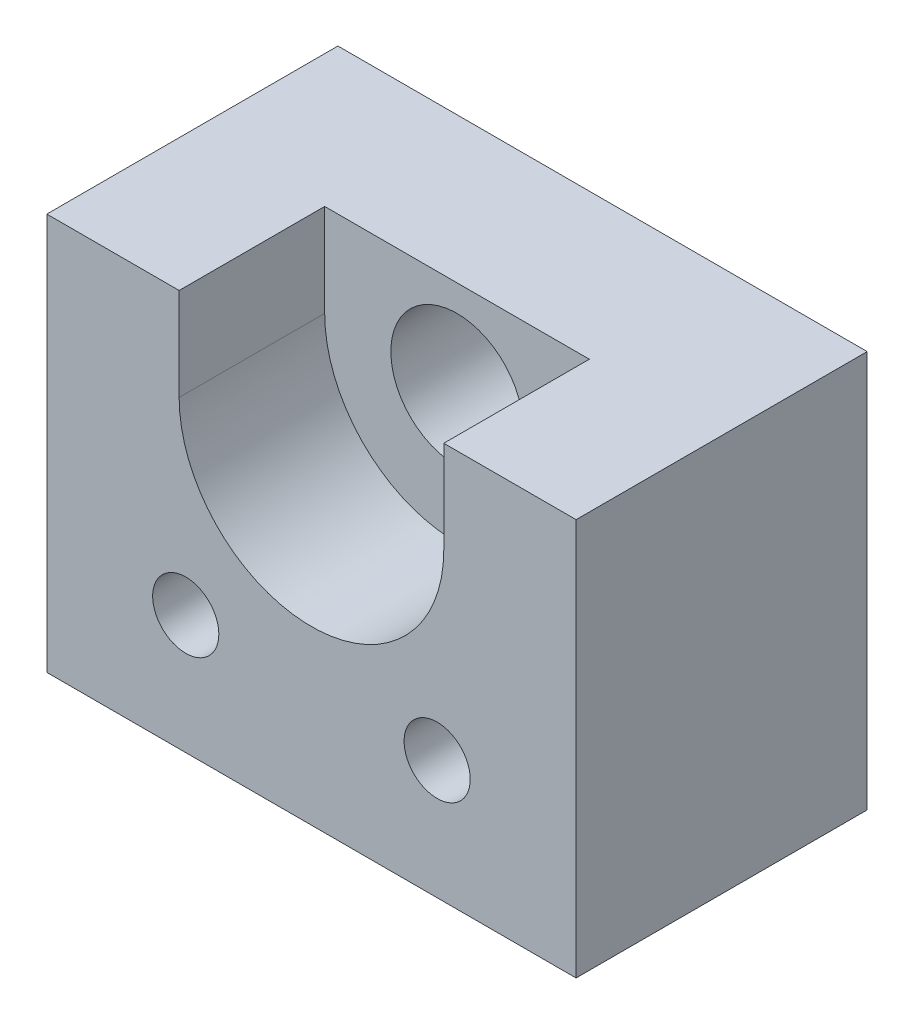
ISO-10303-21;
HEADER;
FILE_DESCRIPTION(('STEP AP214'),'2;1');
FILE_NAME('part.step','',(''),(''),'','','');
FILE_SCHEMA(('AUTOMOTIVE_DESIGN { 1 0 10303 214 1 1 1 1 }'));
ENDSEC;
DATA;
#1=APPLICATION_CONTEXT('core data for automotive mechanical design processes');
#2=APPLICATION_PROTOCOL_DEFINITION('international standard','automotive_design',2000,#1);
#3=PRODUCT_CONTEXT('',#1,'mechanical');
#4=PRODUCT('Part','Part','',(#3));
#5=PRODUCT_RELATED_PRODUCT_CATEGORY('part','',(#4));
#6=PRODUCT_DEFINITION_FORMATION('','',#4);
#7=PRODUCT_DEFINITION_CONTEXT('part definition',#1,'design');
#8=PRODUCT_DEFINITION('design','',#6,#7);
#9=PRODUCT_DEFINITION_SHAPE('','',#8);
#10=(LENGTH_UNIT() NAMED_UNIT(*) SI_UNIT(.MILLI.,.METRE.));
#11=(NAMED_UNIT(*) PLANE_ANGLE_UNIT() SI_UNIT($,.RADIAN.));
#12=(NAMED_UNIT(*) SI_UNIT($,.STERADIAN.) SOLID_ANGLE_UNIT());
#13=UNCERTAINTY_MEASURE_WITH_UNIT(LENGTH_MEASURE(1.E-05),#10,'distance_accuracy_value','');
#14=(GEOMETRIC_REPRESENTATION_CONTEXT(3) GLOBAL_UNCERTAINTY_ASSIGNED_CONTEXT((#13)) GLOBAL_UNIT_ASSIGNED_CONTEXT((#10,
#11,#12)) REPRESENTATION_CONTEXT('',''));
#15=CARTESIAN_POINT('',(0.,0.,0.));
#16=DIRECTION('',(0.,0.,1.));
#17=DIRECTION('',(1.,0.,0.));
#18=AXIS2_PLACEMENT_3D('',#15,#16,#17);
#19=CARTESIAN_POINT('',(10.,11.5,11.));
#20=DIRECTION('',(0.,0.,-1.));
#21=DIRECTION('',(-1.,0.,0.));
#22=AXIS2_PLACEMENT_3D('',#19,#20,#21);
#23=CYLINDRICAL_SURFACE('',#22,2.5);
#24=CARTESIAN_POINT('',(10.,11.5,0.));
#25=DIRECTION('',(0.,0.,1.));
#26=DIRECTION('',(1.,0.,0.));
#27=AXIS2_PLACEMENT_3D('',#24,#25,#26);
#28=CIRCLE('',#27,2.5);
#29=CARTESIAN_POINT('',(12.5,11.5,0.));
#30=VERTEX_POINT('',#29);
#31=EDGE_CURVE('E196',#30,#30,#28,.T.);
#32=ORIENTED_EDGE('',*,*,#31,.F.);
#33=EDGE_LOOP('',(#32));
#34=FACE_BOUND('',#33,.T.);
#35=CARTESIAN_POINT('',(10.,11.5,5.5));
#36=DIRECTION('',(0.,0.,1.));
#37=DIRECTION('',(1.,0.,0.));
#38=AXIS2_PLACEMENT_3D('',#35,#36,#37);
#39=CIRCLE('',#38,2.5);
#40=CARTESIAN_POINT('',(12.5,11.5,5.5));
#41=VERTEX_POINT('',#40);
#42=EDGE_CURVE('E179',#41,#41,#39,.T.);
#43=ORIENTED_EDGE('',*,*,#42,.T.);
#44=EDGE_LOOP('',(#43));
#45=FACE_BOUND('',#44,.T.);
#46=ADVANCED_FACE('F33',(#34,#45),#23,.F.);
#47=CARTESIAN_POINT('',(0.,0.,11.));
#48=DIRECTION('',(0.,0.,-1.));
#49=DIRECTION('',(-1.,0.,0.));
#50=AXIS2_PLACEMENT_3D('',#47,#48,#49);
#51=PLANE('',#50);
#52=CARTESIAN_POINT('',(5.25,4.5,11.));
#53=DIRECTION('',(0.,0.,1.));
#54=DIRECTION('',(1.,0.,0.));
#55=AXIS2_PLACEMENT_3D('',#52,#53,#54);
#56=CIRCLE('',#55,1.25);
#57=CARTESIAN_POINT('',(6.5,4.5,11.));
#58=VERTEX_POINT('',#57);
#59=EDGE_CURVE('E193',#58,#58,#56,.T.);
#60=ORIENTED_EDGE('',*,*,#59,.F.);
#61=EDGE_LOOP('',(#60));
#62=FACE_BOUND('',#61,.T.);
#63=CARTESIAN_POINT('',(10.,11.5,11.));
#64=DIRECTION('',(0.,0.,1.));
#65=DIRECTION('',(1.,0.,0.));
#66=AXIS2_PLACEMENT_3D('',#63,#64,#65);
#67=CIRCLE('',#66,5.);
#68=CARTESIAN_POINT('',(5.,11.5,11.));
#69=VERTEX_POINT('',#68);
#70=CARTESIAN_POINT('',(15.,11.5,11.));
#71=VERTEX_POINT('',#70);
#72=EDGE_CURVE('E144',#69,#71,#67,.T.);
#73=ORIENTED_EDGE('',*,*,#72,.F.);
#74=DIRECTION('',(0.,-1.,0.));
#75=VECTOR('',#74,1.);
#76=CARTESIAN_POINT('',(5.,15.,11.));
#77=LINE('',#76,#75);
#78=CARTESIAN_POINT('',(5.,15.,11.));
#79=VERTEX_POINT('',#78);
#80=EDGE_CURVE('E166',#79,#69,#77,.T.);
#81=ORIENTED_EDGE('',*,*,#80,.F.);
#82=DIRECTION('',(-1.,0.,0.));
#83=VECTOR('',#82,1.);
#84=CARTESIAN_POINT('',(0.,15.,11.));
#85=LINE('',#84,#83);
#86=CARTESIAN_POINT('',(0.,15.,11.));
#87=VERTEX_POINT('',#86);
#88=EDGE_CURVE('E210',#79,#87,#85,.T.);
#89=ORIENTED_EDGE('',*,*,#88,.T.);
#90=DIRECTION('',(0.,-1.,0.));
#91=VECTOR('',#90,1.);
#92=CARTESIAN_POINT('',(0.,0.,11.));
#93=LINE('',#92,#91);
#94=CARTESIAN_POINT('',(0.,0.,11.));
#95=VERTEX_POINT('',#94);
#96=EDGE_CURVE('E202',#87,#95,#93,.T.);
#97=ORIENTED_EDGE('',*,*,#96,.T.);
#98=DIRECTION('',(1.,0.,0.));
#99=VECTOR('',#98,1.);
#100=CARTESIAN_POINT('',(0.,0.,11.));
#101=LINE('',#100,#99);
#102=CARTESIAN_POINT('',(20.,0.,11.));
#103=VERTEX_POINT('',#102);
#104=EDGE_CURVE('E205',#95,#103,#101,.T.);
#105=ORIENTED_EDGE('',*,*,#104,.T.);
#106=DIRECTION('',(0.,1.,0.));
#107=VECTOR('',#106,1.);
#108=CARTESIAN_POINT('',(20.,0.,11.));
#109=LINE('',#108,#107);
#110=CARTESIAN_POINT('',(20.,15.,11.));
#111=VERTEX_POINT('',#110);
#112=EDGE_CURVE('E208',#103,#111,#109,.T.);
#113=ORIENTED_EDGE('',*,*,#112,.T.);
#114=CARTESIAN_POINT('',(15.,15.,11.));
#115=VERTEX_POINT('',#114);
#116=EDGE_CURVE('E211',#111,#115,#85,.T.);
#117=ORIENTED_EDGE('',*,*,#116,.T.);
#118=DIRECTION('',(0.,1.,0.));
#119=VECTOR('',#118,1.);
#120=CARTESIAN_POINT('',(15.,11.5,11.));
#121=LINE('',#120,#119);
#122=EDGE_CURVE('E147',#71,#115,#121,.T.);
#123=ORIENTED_EDGE('',*,*,#122,.F.);
#124=EDGE_LOOP('',(#73,#81,#89,#97,#105,#113,#117,#123));
#125=FACE_BOUND('',#124,.T.);
#126=CARTESIAN_POINT('',(14.75,4.5,11.));
#127=DIRECTION('',(0.,0.,1.));
#128=DIRECTION('',(1.,0.,0.));
#129=AXIS2_PLACEMENT_3D('',#126,#127,#128);
#130=CIRCLE('',#129,1.25);
#131=CARTESIAN_POINT('',(16.,4.5,11.));
#132=VERTEX_POINT('',#131);
#133=EDGE_CURVE('E186',#132,#132,#130,.T.);
#134=ORIENTED_EDGE('',*,*,#133,.F.);
#135=EDGE_LOOP('',(#134));
#136=FACE_BOUND('',#135,.T.);
#137=ADVANCED_FACE('F265',(#62,#125,#136),#51,.F.);
#138=CARTESIAN_POINT('',(0.,0.,0.));
#139=DIRECTION('',(0.,0.,-1.));
#140=DIRECTION('',(-1.,0.,0.));
#141=AXIS2_PLACEMENT_3D('',#138,#139,#140);
#142=PLANE('',#141);
#143=DIRECTION('',(0.,-1.,0.));
#144=VECTOR('',#143,1.);
#145=CARTESIAN_POINT('',(12.4,0.,0.));
#146=LINE('',#145,#144);
#147=CARTESIAN_POINT('',(12.4,6.,0.));
#148=VERTEX_POINT('',#147);
#149=CARTESIAN_POINT('',(12.4,0.,0.));
#150=VERTEX_POINT('',#149);
#151=EDGE_CURVE('E143',#148,#150,#146,.T.);
#152=ORIENTED_EDGE('',*,*,#151,.F.);
#153=DIRECTION('',(1.,0.,0.));
#154=VECTOR('',#153,1.);
#155=CARTESIAN_POINT('',(12.4,6.,0.));
#156=LINE('',#155,#154);
#157=CARTESIAN_POINT('',(7.6,6.,0.));
#158=VERTEX_POINT('',#157);
#159=EDGE_CURVE('E129',#158,#148,#156,.T.);
#160=ORIENTED_EDGE('',*,*,#159,.F.);
#161=DIRECTION('',(0.,1.,0.));
#162=VECTOR('',#161,1.);
#163=CARTESIAN_POINT('',(7.6,0.,0.));
#164=LINE('',#163,#162);
#165=CARTESIAN_POINT('',(7.6,0.,0.));
#166=VERTEX_POINT('',#165);
#167=EDGE_CURVE('E157',#166,#158,#164,.T.);
#168=ORIENTED_EDGE('',*,*,#167,.F.);
#169=DIRECTION('',(1.,0.,0.));
#170=VECTOR('',#169,1.);
#171=CARTESIAN_POINT('',(0.,0.,0.));
#172=LINE('',#171,#170);
#173=CARTESIAN_POINT('',(0.,0.,0.));
#174=VERTEX_POINT('',#173);
#175=EDGE_CURVE('E226',#174,#166,#172,.T.);
#176=ORIENTED_EDGE('',*,*,#175,.F.);
#177=DIRECTION('',(0.,-1.,0.));
#178=VECTOR('',#177,1.);
#179=CARTESIAN_POINT('',(0.,0.,0.));
#180=LINE('',#179,#178);
#181=CARTESIAN_POINT('',(0.,15.,0.));
#182=VERTEX_POINT('',#181);
#183=EDGE_CURVE('E201',#182,#174,#180,.T.);
#184=ORIENTED_EDGE('',*,*,#183,.F.);
#185=DIRECTION('',(-1.,0.,0.));
#186=VECTOR('',#185,1.);
#187=CARTESIAN_POINT('',(0.,15.,0.));
#188=LINE('',#187,#186);
#189=CARTESIAN_POINT('',(20.,15.,0.));
#190=VERTEX_POINT('',#189);
#191=EDGE_CURVE('E206',#190,#182,#188,.T.);
#192=ORIENTED_EDGE('',*,*,#191,.F.);
#193=DIRECTION('',(0.,1.,0.));
#194=VECTOR('',#193,1.);
#195=CARTESIAN_POINT('',(20.,0.,0.));
#196=LINE('',#195,#194);
#197=CARTESIAN_POINT('',(20.,0.,0.));
#198=VERTEX_POINT('',#197);
#199=EDGE_CURVE('E220',#198,#190,#196,.T.);
#200=ORIENTED_EDGE('',*,*,#199,.F.);
#201=EDGE_CURVE('E217',#150,#198,#172,.T.);
#202=ORIENTED_EDGE('',*,*,#201,.F.);
#203=EDGE_LOOP('',(#152,#160,#168,#176,#184,#192,#200,#202));
#204=FACE_BOUND('',#203,.T.);
#205=CARTESIAN_POINT('',(5.25,4.5,0.));
#206=DIRECTION('',(0.,0.,1.));
#207=DIRECTION('',(1.,0.,0.));
#208=AXIS2_PLACEMENT_3D('',#205,#206,#207);
#209=CIRCLE('',#208,1.25);
#210=CARTESIAN_POINT('',(6.5,4.5,0.));
#211=VERTEX_POINT('',#210);
#212=EDGE_CURVE('E189',#211,#211,#209,.T.);
#213=ORIENTED_EDGE('',*,*,#212,.T.);
#214=EDGE_LOOP('',(#213));
#215=FACE_BOUND('',#214,.T.);
#216=ORIENTED_EDGE('',*,*,#31,.T.);
#217=EDGE_LOOP('',(#216));
#218=FACE_BOUND('',#217,.T.);
#219=CARTESIAN_POINT('',(14.75,4.5,0.));
#220=DIRECTION('',(0.,0.,1.));
#221=DIRECTION('',(1.,0.,0.));
#222=AXIS2_PLACEMENT_3D('',#219,#220,#221);
#223=CIRCLE('',#222,1.25);
#224=CARTESIAN_POINT('',(16.,4.5,0.));
#225=VERTEX_POINT('',#224);
#226=EDGE_CURVE('E190',#225,#225,#223,.T.);
#227=ORIENTED_EDGE('',*,*,#226,.T.);
#228=EDGE_LOOP('',(#227));
#229=FACE_BOUND('',#228,.T.);
#230=ADVANCED_FACE('F254',(#204,#215,#218,#229),#142,.T.);
#231=CARTESIAN_POINT('',(0.,0.,11.));
#232=DIRECTION('',(1.,0.,0.));
#233=DIRECTION('',(0.,0.,-1.));
#234=AXIS2_PLACEMENT_3D('',#231,#232,#233);
#235=PLANE('',#234);
#236=ORIENTED_EDGE('',*,*,#183,.T.);
#237=DIRECTION('',(0.,0.,-1.));
#238=VECTOR('',#237,1.);
#239=CARTESIAN_POINT('',(0.,0.,11.));
#240=LINE('',#239,#238);
#241=EDGE_CURVE('E230',#95,#174,#240,.T.);
#242=ORIENTED_EDGE('',*,*,#241,.F.);
#243=ORIENTED_EDGE('',*,*,#96,.F.);
#244=DIRECTION('',(0.,0.,-1.));
#245=VECTOR('',#244,1.);
#246=CARTESIAN_POINT('',(0.,15.,11.));
#247=LINE('',#246,#245);
#248=EDGE_CURVE('E214',#87,#182,#247,.T.);
#249=ORIENTED_EDGE('',*,*,#248,.T.);
#250=EDGE_LOOP('',(#236,#242,#243,#249));
#251=FACE_BOUND('',#250,.T.);
#252=ADVANCED_FACE('F258',(#251),#235,.F.);
#253=CARTESIAN_POINT('',(0.,0.,11.));
#254=DIRECTION('',(0.,1.,0.));
#255=DIRECTION('',(0.,0.,1.));
#256=AXIS2_PLACEMENT_3D('',#253,#254,#255);
#257=PLANE('',#256);
#258=ORIENTED_EDGE('',*,*,#175,.T.);
#259=DIRECTION('',(0.,0.,1.));
#260=VECTOR('',#259,1.);
#261=CARTESIAN_POINT('',(7.6,0.,-5.));
#262=LINE('',#261,#260);
#263=CARTESIAN_POINT('',(7.6,0.,-5.));
#264=VERTEX_POINT('',#263);
#265=EDGE_CURVE('E138',#264,#166,#262,.T.);
#266=ORIENTED_EDGE('',*,*,#265,.F.);
#267=DIRECTION('',(-1.,0.,0.));
#268=VECTOR('',#267,1.);
#269=CARTESIAN_POINT('',(12.4,0.,-5.));
#270=LINE('',#269,#268);
#271=CARTESIAN_POINT('',(12.4,0.,-5.));
#272=VERTEX_POINT('',#271);
#273=EDGE_CURVE('E124',#272,#264,#270,.T.);
#274=ORIENTED_EDGE('',*,*,#273,.F.);
#275=DIRECTION('',(0.,0.,1.));
#276=VECTOR('',#275,1.);
#277=CARTESIAN_POINT('',(12.4,0.,-5.));
#278=LINE('',#277,#276);
#279=EDGE_CURVE('E135',#272,#150,#278,.T.);
#280=ORIENTED_EDGE('',*,*,#279,.T.);
#281=ORIENTED_EDGE('',*,*,#201,.T.);
#282=DIRECTION('',(0.,0.,-1.));
#283=VECTOR('',#282,1.);
#284=CARTESIAN_POINT('',(20.,0.,11.));
#285=LINE('',#284,#283);
#286=EDGE_CURVE('E233',#103,#198,#285,.T.);
#287=ORIENTED_EDGE('',*,*,#286,.F.);
#288=ORIENTED_EDGE('',*,*,#104,.F.);
#289=ORIENTED_EDGE('',*,*,#241,.T.);
#290=EDGE_LOOP('',(#258,#266,#274,#280,#281,#287,#288,#289));
#291=FACE_BOUND('',#290,.T.);
#292=ADVANCED_FACE('F134',(#291),#257,.F.);
#293=CARTESIAN_POINT('',(20.,0.,11.));
#294=DIRECTION('',(-1.,0.,0.));
#295=DIRECTION('',(0.,0.,1.));
#296=AXIS2_PLACEMENT_3D('',#293,#294,#295);
#297=PLANE('',#296);
#298=ORIENTED_EDGE('',*,*,#199,.T.);
#299=DIRECTION('',(0.,0.,-1.));
#300=VECTOR('',#299,1.);
#301=CARTESIAN_POINT('',(20.,15.,11.));
#302=LINE('',#301,#300);
#303=EDGE_CURVE('E236',#111,#190,#302,.T.);
#304=ORIENTED_EDGE('',*,*,#303,.F.);
#305=ORIENTED_EDGE('',*,*,#112,.F.);
#306=ORIENTED_EDGE('',*,*,#286,.T.);
#307=EDGE_LOOP('',(#298,#304,#305,#306));
#308=FACE_BOUND('',#307,.T.);
#309=ADVANCED_FACE('F246',(#308),#297,.F.);
#310=CARTESIAN_POINT('',(0.,15.,11.));
#311=DIRECTION('',(0.,-1.,0.));
#312=DIRECTION('',(0.,0.,-1.));
#313=AXIS2_PLACEMENT_3D('',#310,#311,#312);
#314=PLANE('',#313);
#315=ORIENTED_EDGE('',*,*,#88,.F.);
#316=DIRECTION('',(0.,0.,1.));
#317=VECTOR('',#316,1.);
#318=CARTESIAN_POINT('',(5.,15.,5.5));
#319=LINE('',#318,#317);
#320=CARTESIAN_POINT('',(5.,15.,5.5));
#321=VERTEX_POINT('',#320);
#322=EDGE_CURVE('E180',#321,#79,#319,.T.);
#323=ORIENTED_EDGE('',*,*,#322,.F.);
#324=DIRECTION('',(-1.,0.,0.));
#325=VECTOR('',#324,1.);
#326=CARTESIAN_POINT('',(15.,15.,5.5));
#327=LINE('',#326,#325);
#328=CARTESIAN_POINT('',(15.,15.,5.5));
#329=VERTEX_POINT('',#328);
#330=EDGE_CURVE('E168',#329,#321,#327,.T.);
#331=ORIENTED_EDGE('',*,*,#330,.F.);
#332=DIRECTION('',(0.,0.,1.));
#333=VECTOR('',#332,1.);
#334=CARTESIAN_POINT('',(15.,15.,5.5));
#335=LINE('',#334,#333);
#336=EDGE_CURVE('E182',#329,#115,#335,.T.);
#337=ORIENTED_EDGE('',*,*,#336,.T.);
#338=ORIENTED_EDGE('',*,*,#116,.F.);
#339=ORIENTED_EDGE('',*,*,#303,.T.);
#340=ORIENTED_EDGE('',*,*,#191,.T.);
#341=ORIENTED_EDGE('',*,*,#248,.F.);
#342=EDGE_LOOP('',(#315,#323,#331,#337,#338,#339,#340,#341));
#343=FACE_BOUND('',#342,.T.);
#344=ADVANCED_FACE('F252',(#343),#314,.F.);
#345=CARTESIAN_POINT('',(5.25,4.5,11.));
#346=DIRECTION('',(0.,0.,-1.));
#347=DIRECTION('',(-1.,0.,0.));
#348=AXIS2_PLACEMENT_3D('',#345,#346,#347);
#349=CYLINDRICAL_SURFACE('',#348,1.25);
#350=ORIENTED_EDGE('',*,*,#59,.T.);
#351=EDGE_LOOP('',(#350));
#352=FACE_BOUND('',#351,.T.);
#353=ORIENTED_EDGE('',*,*,#212,.F.);
#354=EDGE_LOOP('',(#353));
#355=FACE_BOUND('',#354,.T.);
#356=ADVANCED_FACE('F294',(#352,#355),#349,.F.);
#357=CARTESIAN_POINT('',(14.75,4.5,11.));
#358=DIRECTION('',(0.,0.,-1.));
#359=DIRECTION('',(-1.,0.,0.));
#360=AXIS2_PLACEMENT_3D('',#357,#358,#359);
#361=CYLINDRICAL_SURFACE('',#360,1.25);
#362=ORIENTED_EDGE('',*,*,#133,.T.);
#363=EDGE_LOOP('',(#362));
#364=FACE_BOUND('',#363,.T.);
#365=ORIENTED_EDGE('',*,*,#226,.F.);
#366=EDGE_LOOP('',(#365));
#367=FACE_BOUND('',#366,.T.);
#368=ADVANCED_FACE('F330',(#364,#367),#361,.F.);
#369=CARTESIAN_POINT('',(10.,11.5,5.5));
#370=DIRECTION('',(0.,0.,1.));
#371=DIRECTION('',(1.,0.,0.));
#372=AXIS2_PLACEMENT_3D('',#369,#370,#371);
#373=CYLINDRICAL_SURFACE('',#372,5.);
#374=ORIENTED_EDGE('',*,*,#72,.T.);
#375=DIRECTION('',(0.,0.,1.));
#376=VECTOR('',#375,1.);
#377=CARTESIAN_POINT('',(15.,11.5,5.5));
#378=LINE('',#377,#376);
#379=CARTESIAN_POINT('',(15.,11.5,5.5));
#380=VERTEX_POINT('',#379);
#381=EDGE_CURVE('E172',#380,#71,#378,.T.);
#382=ORIENTED_EDGE('',*,*,#381,.F.);
#383=CARTESIAN_POINT('',(10.,11.5,5.5));
#384=DIRECTION('',(0.,0.,1.));
#385=DIRECTION('',(1.,0.,0.));
#386=AXIS2_PLACEMENT_3D('',#383,#384,#385);
#387=CIRCLE('',#386,5.);
#388=CARTESIAN_POINT('',(5.,11.5,5.5));
#389=VERTEX_POINT('',#388);
#390=EDGE_CURVE('E162',#389,#380,#387,.T.);
#391=ORIENTED_EDGE('',*,*,#390,.F.);
#392=DIRECTION('',(0.,0.,1.));
#393=VECTOR('',#392,1.);
#394=CARTESIAN_POINT('',(5.,11.5,5.5));
#395=LINE('',#394,#393);
#396=EDGE_CURVE('E177',#389,#69,#395,.T.);
#397=ORIENTED_EDGE('',*,*,#396,.T.);
#398=EDGE_LOOP('',(#374,#382,#391,#397));
#399=FACE_BOUND('',#398,.T.);
#400=ADVANCED_FACE('F337',(#399),#373,.F.);
#401=CARTESIAN_POINT('',(5.,15.,5.5));
#402=DIRECTION('',(-1.,0.,0.));
#403=DIRECTION('',(0.,0.,1.));
#404=AXIS2_PLACEMENT_3D('',#401,#402,#403);
#405=PLANE('',#404);
#406=ORIENTED_EDGE('',*,*,#80,.T.);
#407=ORIENTED_EDGE('',*,*,#396,.F.);
#408=DIRECTION('',(0.,-1.,0.));
#409=VECTOR('',#408,1.);
#410=CARTESIAN_POINT('',(5.,15.,5.5));
#411=LINE('',#410,#409);
#412=EDGE_CURVE('E170',#321,#389,#411,.T.);
#413=ORIENTED_EDGE('',*,*,#412,.F.);
#414=ORIENTED_EDGE('',*,*,#322,.T.);
#415=EDGE_LOOP('',(#406,#407,#413,#414));
#416=FACE_BOUND('',#415,.T.);
#417=ADVANCED_FACE('F269',(#416),#405,.F.);
#418=CARTESIAN_POINT('',(15.,11.5,5.5));
#419=DIRECTION('',(1.,0.,0.));
#420=DIRECTION('',(0.,0.,-1.));
#421=AXIS2_PLACEMENT_3D('',#418,#419,#420);
#422=PLANE('',#421);
#423=ORIENTED_EDGE('',*,*,#122,.T.);
#424=ORIENTED_EDGE('',*,*,#336,.F.);
#425=DIRECTION('',(0.,1.,0.));
#426=VECTOR('',#425,1.);
#427=CARTESIAN_POINT('',(15.,11.5,5.5));
#428=LINE('',#427,#426);
#429=EDGE_CURVE('E165',#380,#329,#428,.T.);
#430=ORIENTED_EDGE('',*,*,#429,.F.);
#431=ORIENTED_EDGE('',*,*,#381,.T.);
#432=EDGE_LOOP('',(#423,#424,#430,#431));
#433=FACE_BOUND('',#432,.T.);
#434=ADVANCED_FACE('F350',(#433),#422,.F.);
#435=CARTESIAN_POINT('',(10.,11.5,5.5));
#436=DIRECTION('',(0.,0.,1.));
#437=DIRECTION('',(1.,0.,0.));
#438=AXIS2_PLACEMENT_3D('',#435,#436,#437);
#439=PLANE('',#438);
#440=ORIENTED_EDGE('',*,*,#42,.F.);
#441=EDGE_LOOP('',(#440));
#442=FACE_BOUND('',#441,.T.);
#443=ORIENTED_EDGE('',*,*,#390,.T.);
#444=ORIENTED_EDGE('',*,*,#429,.T.);
#445=ORIENTED_EDGE('',*,*,#330,.T.);
#446=ORIENTED_EDGE('',*,*,#412,.T.);
#447=EDGE_LOOP('',(#443,#444,#445,#446));
#448=FACE_BOUND('',#447,.T.);
#449=ADVANCED_FACE('F273',(#442,#448),#439,.T.);
#450=CARTESIAN_POINT('',(12.4,0.,-5.));
#451=DIRECTION('',(-1.,0.,0.));
#452=DIRECTION('',(0.,0.,1.));
#453=AXIS2_PLACEMENT_3D('',#450,#451,#452);
#454=PLANE('',#453);
#455=DIRECTION('',(0.,-1.,0.));
#456=VECTOR('',#455,1.);
#457=CARTESIAN_POINT('',(12.4,0.,-5.));
#458=LINE('',#457,#456);
#459=CARTESIAN_POINT('',(12.4,1.00000000000001,-5.));
#460=VERTEX_POINT('',#459);
#461=EDGE_CURVE('E121',#460,#272,#458,.T.);
#462=ORIENTED_EDGE('',*,*,#461,.F.);
#463=DIRECTION('',(0.,-0.707106781186546,-0.707106781186549));
#464=VECTOR('',#463,1.);
#465=CARTESIAN_POINT('',(12.4,1.00000000000001,-5.));
#466=LINE('',#465,#464);
#467=EDGE_CURVE('E41',#460,#148,#466,.F.);
#468=ORIENTED_EDGE('',*,*,#467,.T.);
#469=ORIENTED_EDGE('',*,*,#151,.T.);
#470=ORIENTED_EDGE('',*,*,#279,.F.);
#471=EDGE_LOOP('',(#462,#468,#469,#470));
#472=FACE_BOUND('',#471,.T.);
#473=ADVANCED_FACE('F141',(#472),#454,.F.);
#474=CARTESIAN_POINT('',(7.6,0.,-5.));
#475=DIRECTION('',(1.,0.,0.));
#476=DIRECTION('',(0.,0.,-1.));
#477=AXIS2_PLACEMENT_3D('',#474,#475,#476);
#478=PLANE('',#477);
#479=ORIENTED_EDGE('',*,*,#167,.T.);
#480=DIRECTION('',(0.,0.707106781186546,0.707106781186549));
#481=VECTOR('',#480,1.);
#482=CARTESIAN_POINT('',(7.6,1.00000000000001,-5.));
#483=LINE('',#482,#481);
#484=CARTESIAN_POINT('',(7.6,1.00000000000001,-5.));
#485=VERTEX_POINT('',#484);
#486=EDGE_CURVE('E11',#158,#485,#483,.F.);
#487=ORIENTED_EDGE('',*,*,#486,.T.);
#488=DIRECTION('',(0.,1.,0.));
#489=VECTOR('',#488,1.);
#490=CARTESIAN_POINT('',(7.6,0.,-5.));
#491=LINE('',#490,#489);
#492=EDGE_CURVE('E139',#264,#485,#491,.T.);
#493=ORIENTED_EDGE('',*,*,#492,.F.);
#494=ORIENTED_EDGE('',*,*,#265,.T.);
#495=EDGE_LOOP('',(#479,#487,#493,#494));
#496=FACE_BOUND('',#495,.T.);
#497=ADVANCED_FACE('F281',(#496),#478,.F.);
#498=CARTESIAN_POINT('',(0.,0.,-5.));
#499=DIRECTION('',(0.,0.,1.));
#500=DIRECTION('',(1.,0.,0.));
#501=AXIS2_PLACEMENT_3D('',#498,#499,#500);
#502=PLANE('',#501);
#503=ORIENTED_EDGE('',*,*,#492,.T.);
#504=DIRECTION('',(1.,0.,0.));
#505=VECTOR('',#504,1.);
#506=CARTESIAN_POINT('',(0.,1.00000000000001,-5.));
#507=LINE('',#506,#505);
#508=EDGE_CURVE('E126',#485,#460,#507,.T.);
#509=ORIENTED_EDGE('',*,*,#508,.T.);
#510=ORIENTED_EDGE('',*,*,#461,.T.);
#511=ORIENTED_EDGE('',*,*,#273,.T.);
#512=EDGE_LOOP('',(#503,#509,#510,#511));
#513=FACE_BOUND('',#512,.T.);
#514=ADVANCED_FACE('F123',(#513),#502,.F.);
#515=CARTESIAN_POINT('',(0.,1.00000000000001,-5.));
#516=DIRECTION('',(0.,-0.707106781186549,0.707106781186546));
#517=DIRECTION('',(1.,0.,0.));
#518=AXIS2_PLACEMENT_3D('',#515,#516,#517);
#519=PLANE('',#518);
#520=ORIENTED_EDGE('',*,*,#486,.F.);
#521=ORIENTED_EDGE('',*,*,#159,.T.);
#522=ORIENTED_EDGE('',*,*,#467,.F.);
#523=ORIENTED_EDGE('',*,*,#508,.F.);
#524=EDGE_LOOP('',(#520,#521,#522,#523));
#525=FACE_BOUND('',#524,.T.);
#526=ADVANCED_FACE('F35',(#525),#519,.F.);
#527=CLOSED_SHELL('',(#46,#137,#230,#252,#292,#309,#344,#356,#368,#400,#417,#434,#449,#473,#497,
#514,#526));
#528=MANIFOLD_SOLID_BREP('B2',#527);
#529=ADVANCED_BREP_SHAPE_REPRESENTATION('',(#18,#528),#14);
#530=SHAPE_DEFINITION_REPRESENTATION(#9,#529);
ENDSEC;
END-ISO-10303-21;
